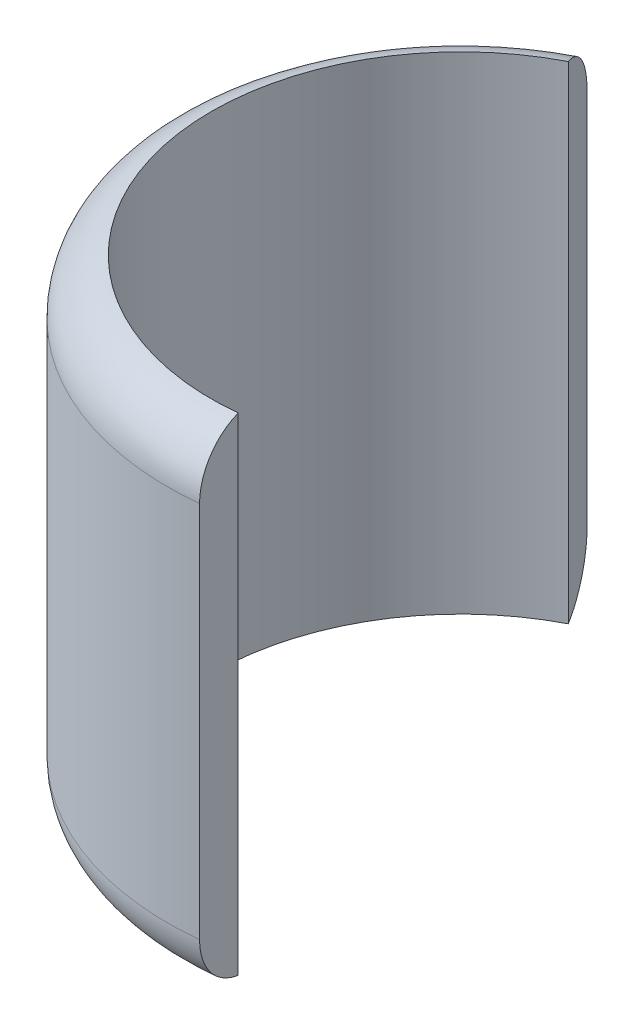
ISO-10303-21;
HEADER;
FILE_DESCRIPTION(('STEP AP214'),'2;1');
FILE_NAME('part.step','',(''),(''),'','','');
FILE_SCHEMA(('AUTOMOTIVE_DESIGN { 1 0 10303 214 1 1 1 1 }'));
ENDSEC;
DATA;
#1=APPLICATION_CONTEXT('core data for automotive mechanical design processes');
#2=APPLICATION_PROTOCOL_DEFINITION('international standard','automotive_design',2000,#1);
#3=PRODUCT_CONTEXT('',#1,'mechanical');
#4=PRODUCT('Part','Part','',(#3));
#5=PRODUCT_RELATED_PRODUCT_CATEGORY('part','',(#4));
#6=PRODUCT_DEFINITION_FORMATION('','',#4);
#7=PRODUCT_DEFINITION_CONTEXT('part definition',#1,'design');
#8=PRODUCT_DEFINITION('design','',#6,#7);
#9=PRODUCT_DEFINITION_SHAPE('','',#8);
#10=(LENGTH_UNIT() NAMED_UNIT(*) SI_UNIT(.MILLI.,.METRE.));
#11=(NAMED_UNIT(*) PLANE_ANGLE_UNIT() SI_UNIT($,.RADIAN.));
#12=(NAMED_UNIT(*) SI_UNIT($,.STERADIAN.) SOLID_ANGLE_UNIT());
#13=UNCERTAINTY_MEASURE_WITH_UNIT(LENGTH_MEASURE(1.E-05),#10,'distance_accuracy_value','');
#14=(GEOMETRIC_REPRESENTATION_CONTEXT(3) GLOBAL_UNCERTAINTY_ASSIGNED_CONTEXT((#13)) GLOBAL_UNIT_ASSIGNED_CONTEXT((#10,
#11,#12)) REPRESENTATION_CONTEXT('',''));
#15=CARTESIAN_POINT('',(0.,0.,0.));
#16=DIRECTION('',(0.,0.,1.));
#17=DIRECTION('',(1.,0.,0.));
#18=AXIS2_PLACEMENT_3D('',#15,#16,#17);
#19=CARTESIAN_POINT('',(0.,33.23,0.));
#20=DIRECTION('',(0.,-1.,0.));
#21=DIRECTION('',(0.,0.,-1.));
#22=AXIS2_PLACEMENT_3D('',#19,#20,#21);
#23=CYLINDRICAL_SURFACE('',#22,17.);
#24=CARTESIAN_POINT('',(0.,0.,0.));
#25=DIRECTION('',(0.,1.,0.));
#26=DIRECTION('',(0.,0.,1.));
#27=AXIS2_PLACEMENT_3D('',#24,#25,#26);
#28=CIRCLE('',#27,17.);
#29=CARTESIAN_POINT('',(-7.76902492471386,0.,-15.1209209944095));
#30=VERTEX_POINT('',#29);
#31=CARTESIAN_POINT('',(1.73973635445557,0.,16.9107456197823));
#32=VERTEX_POINT('',#31);
#33=EDGE_CURVE('E96',#30,#32,#28,.T.);
#34=ORIENTED_EDGE('',*,*,#33,.F.);
#35=DIRECTION('',(0.,-1.,0.));
#36=VECTOR('',#35,1.);
#37=CARTESIAN_POINT('',(-7.76902492471386,33.23,-15.1209209944095));
#38=LINE('',#37,#36);
#39=CARTESIAN_POINT('',(-7.76902492471386,33.23,-15.1209209944095));
#40=VERTEX_POINT('',#39);
#41=EDGE_CURVE('E84',#40,#30,#38,.T.);
#42=ORIENTED_EDGE('',*,*,#41,.F.);
#43=CARTESIAN_POINT('',(0.,33.23,0.));
#44=DIRECTION('',(0.,1.,0.));
#45=DIRECTION('',(0.,0.,1.));
#46=AXIS2_PLACEMENT_3D('',#43,#44,#45);
#47=CIRCLE('',#46,17.);
#48=CARTESIAN_POINT('',(1.73973635445557,33.23,16.9107456197823));
#49=VERTEX_POINT('',#48);
#50=EDGE_CURVE('E94',#40,#49,#47,.T.);
#51=ORIENTED_EDGE('',*,*,#50,.T.);
#52=DIRECTION('',(0.,-1.,0.));
#53=VECTOR('',#52,1.);
#54=CARTESIAN_POINT('',(1.73973635445557,33.23,16.9107456197823));
#55=LINE('',#54,#53);
#56=EDGE_CURVE('E102',#49,#32,#55,.T.);
#57=ORIENTED_EDGE('',*,*,#56,.T.);
#58=EDGE_LOOP('',(#34,#42,#51,#57));
#59=FACE_BOUND('',#58,.T.);
#60=ADVANCED_FACE('F43',(#59),#23,.F.);
#61=CARTESIAN_POINT('',(0.,33.23,0.));
#62=DIRECTION('',(-0.889465940847619,0.,0.457001466159639));
#63=DIRECTION('',(0.457001466159639,0.,0.889465940847619));
#64=AXIS2_PLACEMENT_3D('',#61,#62,#63);
#65=PLANE('',#64);
#66=ORIENTED_EDGE('',*,*,#41,.T.);
#67=CARTESIAN_POINT('',(-7.37143364915498,3.72987935461725,-14.3470856258721));
#68=DIRECTION('',(-0.889465940847619,0.,0.457001466159639));
#69=DIRECTION('',(0.457001466159639,0.,0.889465940847619));
#70=AXIS2_PLACEMENT_3D('',#67,#68,#69);
#71=CIRCLE('',#70,3.83);
#72=CARTESIAN_POINT('',(-9.12174926454639,3.72987935461725,-17.7537401793185));
#73=VERTEX_POINT('',#72);
#74=EDGE_CURVE('E11',#30,#73,#71,.F.);
#75=ORIENTED_EDGE('',*,*,#74,.T.);
#76=DIRECTION('',(0.,-1.,0.));
#77=VECTOR('',#76,1.);
#78=CARTESIAN_POINT('',(-9.12174926454639,33.23,-17.7537401793185));
#79=LINE('',#78,#77);
#80=CARTESIAN_POINT('',(-9.12174926454639,29.5001206453827,-17.7537401793185));
#81=VERTEX_POINT('',#80);
#82=EDGE_CURVE('E86',#81,#73,#79,.T.);
#83=ORIENTED_EDGE('',*,*,#82,.F.);
#84=CARTESIAN_POINT('',(-7.37143364915498,29.5001206453827,-14.3470856258721));
#85=DIRECTION('',(-0.889465940847619,0.,0.457001466159639));
#86=DIRECTION('',(0.457001466159639,0.,0.889465940847619));
#87=AXIS2_PLACEMENT_3D('',#84,#85,#86);
#88=CIRCLE('',#87,3.83);
#89=EDGE_CURVE('E52',#81,#40,#88,.F.);
#90=ORIENTED_EDGE('',*,*,#89,.T.);
#91=EDGE_LOOP('',(#66,#75,#83,#90));
#92=FACE_BOUND('',#91,.T.);
#93=ADVANCED_FACE('F83',(#92),#65,.F.);
#94=CARTESIAN_POINT('',(0.,33.23,0.));
#95=DIRECTION('',(0.,-1.,0.));
#96=DIRECTION('',(0.,0.,-1.));
#97=AXIS2_PLACEMENT_3D('',#94,#95,#96);
#98=CYLINDRICAL_SURFACE('',#97,19.96);
#99=ORIENTED_EDGE('',*,*,#82,.T.);
#100=CARTESIAN_POINT('',(0.,3.72987935461725,0.));
#101=DIRECTION('',(0.,-1.,0.));
#102=DIRECTION('',(0.,0.,-1.));
#103=AXIS2_PLACEMENT_3D('',#100,#101,#102);
#104=CIRCLE('',#103,19.96);
#105=CARTESIAN_POINT('',(2.04265515499606,3.72987935461725,19.8552048571091));
#106=VERTEX_POINT('',#105);
#107=EDGE_CURVE('E117',#73,#106,#104,.F.);
#108=ORIENTED_EDGE('',*,*,#107,.T.);
#109=DIRECTION('',(0.,-1.,0.));
#110=VECTOR('',#109,1.);
#111=CARTESIAN_POINT('',(2.04265515499606,33.23,19.8552048571091));
#112=LINE('',#111,#110);
#113=CARTESIAN_POINT('',(2.04265515499606,29.5001206453827,19.8552048571091));
#114=VERTEX_POINT('',#113);
#115=EDGE_CURVE('E106',#114,#106,#112,.T.);
#116=ORIENTED_EDGE('',*,*,#115,.F.);
#117=CARTESIAN_POINT('',(0.,29.5001206453827,0.));
#118=DIRECTION('',(0.,1.,0.));
#119=DIRECTION('',(0.,0.,1.));
#120=AXIS2_PLACEMENT_3D('',#117,#118,#119);
#121=CIRCLE('',#120,19.96);
#122=EDGE_CURVE('E64',#114,#81,#121,.F.);
#123=ORIENTED_EDGE('',*,*,#122,.T.);
#124=EDGE_LOOP('',(#99,#108,#116,#123));
#125=FACE_BOUND('',#124,.T.);
#126=ADVANCED_FACE('F129',(#125),#98,.T.);
#127=CARTESIAN_POINT('',(0.,33.23,0.));
#128=DIRECTION('',(0.994749742340134,0.,-0.102337432615033));
#129=DIRECTION('',(-0.102337432615033,0.,-0.994749742340134));
#130=AXIS2_PLACEMENT_3D('',#127,#128,#129);
#131=PLANE('',#130);
#132=ORIENTED_EDGE('',*,*,#115,.T.);
#133=CARTESIAN_POINT('',(1.65070278808049,3.72987935461725,16.0453133439464));
#134=DIRECTION('',(0.994749742340134,0.,-0.102337432615033));
#135=DIRECTION('',(-0.102337432615033,0.,-0.994749742340134));
#136=AXIS2_PLACEMENT_3D('',#133,#134,#135);
#137=CIRCLE('',#136,3.83);
#138=EDGE_CURVE('E90',#106,#32,#137,.T.);
#139=ORIENTED_EDGE('',*,*,#138,.T.);
#140=ORIENTED_EDGE('',*,*,#56,.F.);
#141=CARTESIAN_POINT('',(1.65070278808049,29.5001206453827,16.0453133439464));
#142=DIRECTION('',(0.994749742340134,0.,-0.102337432615033));
#143=DIRECTION('',(-0.102337432615033,0.,-0.994749742340134));
#144=AXIS2_PLACEMENT_3D('',#141,#142,#143);
#145=CIRCLE('',#144,3.83);
#146=EDGE_CURVE('E99',#49,#114,#145,.T.);
#147=ORIENTED_EDGE('',*,*,#146,.T.);
#148=EDGE_LOOP('',(#132,#139,#140,#147));
#149=FACE_BOUND('',#148,.T.);
#150=ADVANCED_FACE('F125',(#149),#131,.T.);
#151=CARTESIAN_POINT('',(0.,3.72987935461725,0.));
#152=DIRECTION('',(0.,-1.,0.));
#153=DIRECTION('',(0.,0.,-1.));
#154=AXIS2_PLACEMENT_3D('',#151,#152,#153);
#155=TOROIDAL_SURFACE('',#154,16.13,3.83);
#156=ORIENTED_EDGE('',*,*,#74,.F.);
#157=ORIENTED_EDGE('',*,*,#33,.T.);
#158=ORIENTED_EDGE('',*,*,#138,.F.);
#159=ORIENTED_EDGE('',*,*,#107,.F.);
#160=EDGE_LOOP('',(#156,#157,#158,#159));
#161=FACE_BOUND('',#160,.T.);
#162=ADVANCED_FACE('F128',(#161),#155,.T.);
#163=CARTESIAN_POINT('',(0.,29.5001206453827,0.));
#164=DIRECTION('',(0.,1.,0.));
#165=DIRECTION('',(0.,0.,1.));
#166=AXIS2_PLACEMENT_3D('',#163,#164,#165);
#167=TOROIDAL_SURFACE('',#166,16.13,3.83);
#168=ORIENTED_EDGE('',*,*,#89,.F.);
#169=ORIENTED_EDGE('',*,*,#122,.F.);
#170=ORIENTED_EDGE('',*,*,#146,.F.);
#171=ORIENTED_EDGE('',*,*,#50,.F.);
#172=EDGE_LOOP('',(#168,#169,#170,#171));
#173=FACE_BOUND('',#172,.T.);
#174=ADVANCED_FACE('F45',(#173),#167,.T.);
#175=CLOSED_SHELL('',(#60,#93,#126,#150,#162,#174));
#176=MANIFOLD_SOLID_BREP('B2',#175);
#177=ADVANCED_BREP_SHAPE_REPRESENTATION('',(#18,#176),#14);
#178=SHAPE_DEFINITION_REPRESENTATION(#9,#177);
ENDSEC;
END-ISO-10303-21;
